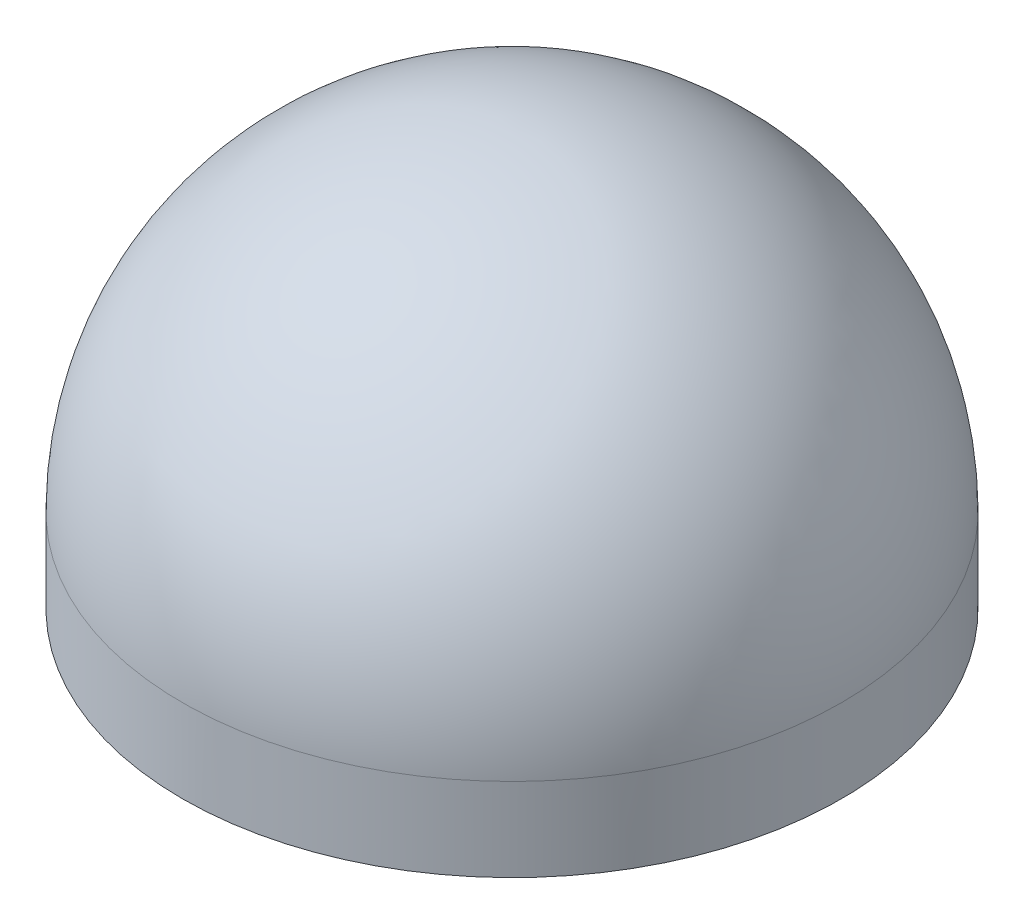
ISO-10303-21;
HEADER;
FILE_DESCRIPTION(('STEP AP214'),'2;1');
FILE_NAME('part.step','',(''),(''),'','','');
FILE_SCHEMA(('AUTOMOTIVE_DESIGN { 1 0 10303 214 1 1 1 1 }'));
ENDSEC;
DATA;
#1=APPLICATION_CONTEXT('core data for automotive mechanical design processes');
#2=APPLICATION_PROTOCOL_DEFINITION('international standard','automotive_design',2000,#1);
#3=PRODUCT_CONTEXT('',#1,'mechanical');
#4=PRODUCT('Part','Part','',(#3));
#5=PRODUCT_RELATED_PRODUCT_CATEGORY('part','',(#4));
#6=PRODUCT_DEFINITION_FORMATION('','',#4);
#7=PRODUCT_DEFINITION_CONTEXT('part definition',#1,'design');
#8=PRODUCT_DEFINITION('design','',#6,#7);
#9=PRODUCT_DEFINITION_SHAPE('','',#8);
#10=(LENGTH_UNIT() NAMED_UNIT(*) SI_UNIT(.MILLI.,.METRE.));
#11=(NAMED_UNIT(*) PLANE_ANGLE_UNIT() SI_UNIT($,.RADIAN.));
#12=(NAMED_UNIT(*) SI_UNIT($,.STERADIAN.) SOLID_ANGLE_UNIT());
#13=UNCERTAINTY_MEASURE_WITH_UNIT(LENGTH_MEASURE(1.E-05),#10,'distance_accuracy_value','');
#14=(GEOMETRIC_REPRESENTATION_CONTEXT(3) GLOBAL_UNCERTAINTY_ASSIGNED_CONTEXT((#13)) GLOBAL_UNIT_ASSIGNED_CONTEXT((#10,
#11,#12)) REPRESENTATION_CONTEXT('',''));
#15=CARTESIAN_POINT('',(0.,0.,0.));
#16=DIRECTION('',(0.,0.,1.));
#17=DIRECTION('',(1.,0.,0.));
#18=AXIS2_PLACEMENT_3D('',#15,#16,#17);
#19=CARTESIAN_POINT('',(0.,0.,0.));
#20=DIRECTION('',(0.,-1.,0.));
#21=DIRECTION('',(0.,0.,-1.));
#22=AXIS2_PLACEMENT_3D('',#19,#20,#21);
#23=PLANE('',#22);
#24=CARTESIAN_POINT('',(0.,0.,0.));
#25=DIRECTION('',(0.,-1.,0.));
#26=DIRECTION('',(0.,0.,-1.));
#27=AXIS2_PLACEMENT_3D('',#24,#25,#26);
#28=CIRCLE('',#27,47.5);
#29=CARTESIAN_POINT('',(0.,0.,-47.5));
#30=VERTEX_POINT('',#29);
#31=EDGE_CURVE('E10',#30,#30,#28,.T.);
#32=ORIENTED_EDGE('',*,*,#31,.T.);
#33=EDGE_LOOP('',(#32));
#34=FACE_BOUND('',#33,.T.);
#35=ADVANCED_FACE('F37',(#34),#23,.T.);
#36=CARTESIAN_POINT('',(0.,0.,0.));
#37=DIRECTION('',(0.,-1.,0.));
#38=DIRECTION('',(0.,0.,-1.));
#39=AXIS2_PLACEMENT_3D('',#36,#37,#38);
#40=CYLINDRICAL_SURFACE('',#39,47.5);
#41=CARTESIAN_POINT('',(0.,12.,0.));
#42=DIRECTION('',(0.,-1.,0.));
#43=DIRECTION('',(0.,0.,-1.));
#44=AXIS2_PLACEMENT_3D('',#41,#42,#43);
#45=CIRCLE('',#44,47.5);
#46=CARTESIAN_POINT('',(0.,12.,-47.5));
#47=VERTEX_POINT('',#46);
#48=EDGE_CURVE('E43',#47,#47,#45,.T.);
#49=ORIENTED_EDGE('',*,*,#48,.T.);
#50=EDGE_LOOP('',(#49));
#51=FACE_BOUND('',#50,.T.);
#52=ORIENTED_EDGE('',*,*,#31,.F.);
#53=EDGE_LOOP('',(#52));
#54=FACE_BOUND('',#53,.T.);
#55=ADVANCED_FACE('F49',(#51,#54),#40,.T.);
#56=CARTESIAN_POINT('',(0.,12.,0.));
#57=DIRECTION('',(0.,-1.,0.));
#58=DIRECTION('',(1.,0.,0.));
#59=AXIS2_PLACEMENT_3D('',#56,#57,#58);
#60=SPHERICAL_SURFACE('',#59,47.5);
#61=ORIENTED_EDGE('',*,*,#48,.F.);
#62=EDGE_LOOP('',(#61));
#63=FACE_BOUND('',#62,.T.);
#64=ADVANCED_FACE('F52',(#63),#60,.T.);
#65=CLOSED_SHELL('',(#35,#55,#64));
#66=MANIFOLD_SOLID_BREP('B2',#65);
#67=ADVANCED_BREP_SHAPE_REPRESENTATION('',(#18,#66),#14);
#68=SHAPE_DEFINITION_REPRESENTATION(#9,#67);
ENDSEC;
END-ISO-10303-21;
